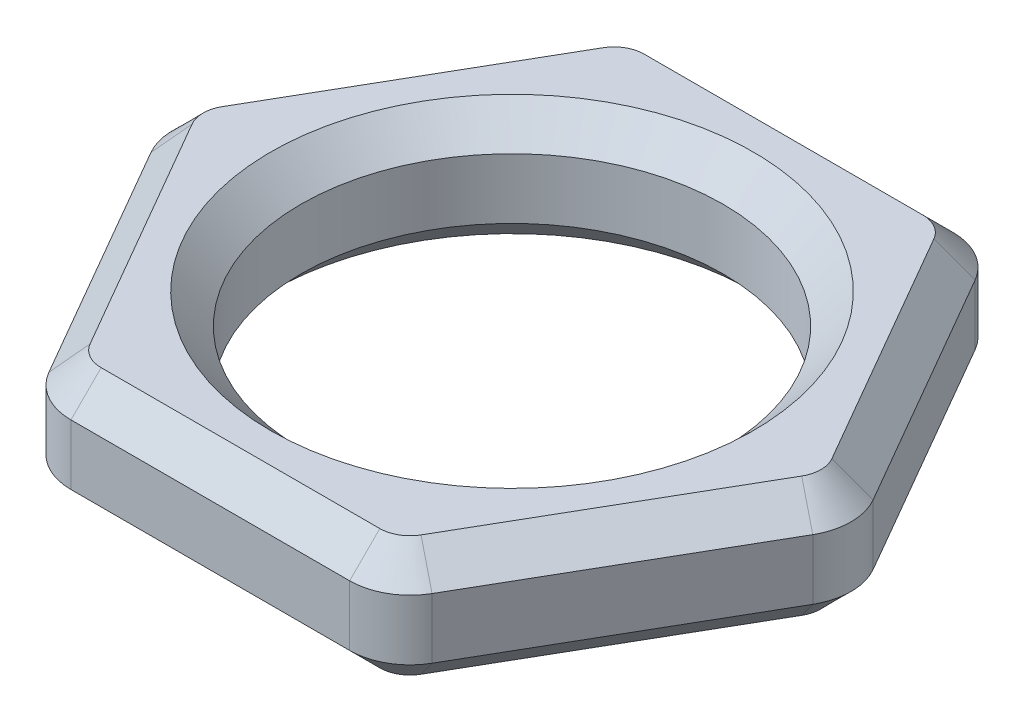
ISO-10303-21;
HEADER;
FILE_DESCRIPTION(('STEP AP214'),'2;1');
FILE_NAME('part.step','',(''),(''),'','','');
FILE_SCHEMA(('AUTOMOTIVE_DESIGN { 1 0 10303 214 1 1 1 1 }'));
ENDSEC;
DATA;
#1=APPLICATION_CONTEXT('core data for automotive mechanical design processes');
#2=APPLICATION_PROTOCOL_DEFINITION('international standard','automotive_design',2000,#1);
#3=PRODUCT_CONTEXT('',#1,'mechanical');
#4=PRODUCT('Part','Part','',(#3));
#5=PRODUCT_RELATED_PRODUCT_CATEGORY('part','',(#4));
#6=PRODUCT_DEFINITION_FORMATION('','',#4);
#7=PRODUCT_DEFINITION_CONTEXT('part definition',#1,'design');
#8=PRODUCT_DEFINITION('design','',#6,#7);
#9=PRODUCT_DEFINITION_SHAPE('','',#8);
#10=(LENGTH_UNIT() NAMED_UNIT(*) SI_UNIT(.MILLI.,.METRE.));
#11=(NAMED_UNIT(*) PLANE_ANGLE_UNIT() SI_UNIT($,.RADIAN.));
#12=(NAMED_UNIT(*) SI_UNIT($,.STERADIAN.) SOLID_ANGLE_UNIT());
#13=UNCERTAINTY_MEASURE_WITH_UNIT(LENGTH_MEASURE(1.E-05),#10,'distance_accuracy_value','');
#14=(GEOMETRIC_REPRESENTATION_CONTEXT(3) GLOBAL_UNCERTAINTY_ASSIGNED_CONTEXT((#13)) GLOBAL_UNIT_ASSIGNED_CONTEXT((#10,
#11,#12)) REPRESENTATION_CONTEXT('',''));
#15=CARTESIAN_POINT('',(0.,0.,0.));
#16=DIRECTION('',(0.,0.,1.));
#17=DIRECTION('',(1.,0.,0.));
#18=AXIS2_PLACEMENT_3D('',#15,#16,#17);
#19=CARTESIAN_POINT('',(0.,2.,0.));
#20=DIRECTION('',(0.,1.,0.));
#21=DIRECTION('',(0.,0.,1.));
#22=AXIS2_PLACEMENT_3D('',#19,#20,#21);
#23=PLANE('',#22);
#24=CARTESIAN_POINT('',(0.,2.,0.));
#25=DIRECTION('',(0.,1.,0.));
#26=DIRECTION('',(0.,0.,1.));
#27=AXIS2_PLACEMENT_3D('',#24,#25,#26);
#28=CIRCLE('',#27,4.);
#29=CARTESIAN_POINT('',(0.,2.,4.));
#30=VERTEX_POINT('',#29);
#31=EDGE_CURVE('E226',#30,#30,#28,.F.);
#32=ORIENTED_EDGE('',*,*,#31,.T.);
#33=EDGE_LOOP('',(#32));
#34=FACE_BOUND('',#33,.T.);
#35=DIRECTION('',(-1.,0.,0.));
#36=VECTOR('',#35,1.);
#37=CARTESIAN_POINT('',(-2.30940107675853,2.,-4.5));
#38=LINE('',#37,#36);
#39=CARTESIAN_POINT('',(2.30940107675849,2.,-4.50000000000001));
#40=VERTEX_POINT('',#39);
#41=CARTESIAN_POINT('',(-2.30940107675853,2.,-4.5));
#42=VERTEX_POINT('',#41);
#43=EDGE_CURVE('E224',#40,#42,#38,.T.);
#44=ORIENTED_EDGE('',*,*,#43,.T.);
#45=CARTESIAN_POINT('',(-2.30940107675852,2.,-3.99999999999999));
#46=DIRECTION('',(0.,1.,0.));
#47=DIRECTION('',(0.,0.,1.));
#48=AXIS2_PLACEMENT_3D('',#45,#46,#47);
#49=CIRCLE('',#48,0.500000000000003);
#50=CARTESIAN_POINT('',(-2.74241377865075,2.,-4.24999999999999));
#51=VERTEX_POINT('',#50);
#52=EDGE_CURVE('E206',#42,#51,#49,.T.);
#53=ORIENTED_EDGE('',*,*,#52,.T.);
#54=DIRECTION('',(-0.499999999999995,0.,0.866025403784442));
#55=VECTOR('',#54,1.);
#56=CARTESIAN_POINT('',(-5.05181485540923,2.,-0.249999999999968));
#57=LINE('',#56,#55);
#58=CARTESIAN_POINT('',(-5.05181485540923,2.,-0.249999999999967));
#59=VERTEX_POINT('',#58);
#60=EDGE_CURVE('E214',#51,#59,#57,.T.);
#61=ORIENTED_EDGE('',*,*,#60,.T.);
#62=CARTESIAN_POINT('',(-4.61880215351701,2.,0.));
#63=DIRECTION('',(0.,1.,0.));
#64=DIRECTION('',(0.,0.,1.));
#65=AXIS2_PLACEMENT_3D('',#62,#63,#64);
#66=CIRCLE('',#65,0.500000000000003);
#67=CARTESIAN_POINT('',(-5.05181485540923,2.,0.250000000000036));
#68=VERTEX_POINT('',#67);
#69=EDGE_CURVE('E220',#59,#68,#66,.T.);
#70=ORIENTED_EDGE('',*,*,#69,.T.);
#71=DIRECTION('',(0.500000000000007,0.,0.866025403784435));
#72=VECTOR('',#71,1.);
#73=CARTESIAN_POINT('',(-2.74241377865069,2.,4.25000000000003));
#74=LINE('',#73,#72);
#75=CARTESIAN_POINT('',(-2.74241377865069,2.,4.25000000000003));
#76=VERTEX_POINT('',#75);
#77=EDGE_CURVE('E421',#68,#76,#74,.T.);
#78=ORIENTED_EDGE('',*,*,#77,.T.);
#79=CARTESIAN_POINT('',(-2.30940107675847,2.,4.00000000000002));
#80=DIRECTION('',(0.,1.,0.));
#81=DIRECTION('',(0.,0.,1.));
#82=AXIS2_PLACEMENT_3D('',#79,#80,#81);
#83=CIRCLE('',#82,0.500000000000003);
#84=CARTESIAN_POINT('',(-2.30940107675846,2.,4.50000000000003));
#85=VERTEX_POINT('',#84);
#86=EDGE_CURVE('E423',#76,#85,#83,.T.);
#87=ORIENTED_EDGE('',*,*,#86,.T.);
#88=DIRECTION('',(1.,0.,0.));
#89=VECTOR('',#88,1.);
#90=CARTESIAN_POINT('',(2.30940107675856,2.,4.49999999999998));
#91=LINE('',#90,#89);
#92=CARTESIAN_POINT('',(2.30940107675856,2.,4.49999999999998));
#93=VERTEX_POINT('',#92);
#94=EDGE_CURVE('E425',#85,#93,#91,.T.);
#95=ORIENTED_EDGE('',*,*,#94,.T.);
#96=CARTESIAN_POINT('',(2.30940107675856,2.,3.99999999999998));
#97=DIRECTION('',(0.,1.,0.));
#98=DIRECTION('',(0.,0.,1.));
#99=AXIS2_PLACEMENT_3D('',#96,#97,#98);
#100=CIRCLE('',#99,0.500000000000003);
#101=CARTESIAN_POINT('',(2.74241377865078,2.,4.24999999999997));
#102=VERTEX_POINT('',#101);
#103=EDGE_CURVE('E427',#93,#102,#100,.T.);
#104=ORIENTED_EDGE('',*,*,#103,.T.);
#105=DIRECTION('',(0.499999999999995,0.,-0.866025403784442));
#106=VECTOR('',#105,1.);
#107=CARTESIAN_POINT('',(5.05181485540923,2.,0.250000000000005));
#108=LINE('',#107,#106);
#109=CARTESIAN_POINT('',(5.05181485540924,2.,0.250000000000004));
#110=VERTEX_POINT('',#109);
#111=EDGE_CURVE('E429',#102,#110,#108,.T.);
#112=ORIENTED_EDGE('',*,*,#111,.T.);
#113=CARTESIAN_POINT('',(4.61880215351701,2.,0.));
#114=DIRECTION('',(0.,1.,0.));
#115=DIRECTION('',(0.,0.,1.));
#116=AXIS2_PLACEMENT_3D('',#113,#114,#115);
#117=CIRCLE('',#116,0.500000000000003);
#118=CARTESIAN_POINT('',(5.05181485540923,2.,-0.249999999999998));
#119=VERTEX_POINT('',#118);
#120=EDGE_CURVE('E431',#110,#119,#117,.T.);
#121=ORIENTED_EDGE('',*,*,#120,.T.);
#122=DIRECTION('',(-0.500000000000001,0.,-0.866025403784438));
#123=VECTOR('',#122,1.);
#124=CARTESIAN_POINT('',(2.74241377865072,2.,-4.25000000000001));
#125=LINE('',#124,#123);
#126=CARTESIAN_POINT('',(2.74241377865072,2.,-4.25000000000001));
#127=VERTEX_POINT('',#126);
#128=EDGE_CURVE('E433',#119,#127,#125,.T.);
#129=ORIENTED_EDGE('',*,*,#128,.T.);
#130=CARTESIAN_POINT('',(2.3094010767585,2.,-4.00000000000001));
#131=DIRECTION('',(0.,1.,0.));
#132=DIRECTION('',(0.,0.,1.));
#133=AXIS2_PLACEMENT_3D('',#130,#131,#132);
#134=CIRCLE('',#133,0.500000000000003);
#135=EDGE_CURVE('E231',#127,#40,#134,.T.);
#136=ORIENTED_EDGE('',*,*,#135,.T.);
#137=EDGE_LOOP('',(#44,#53,#61,#70,#78,#87,#95,#104,#112,#121,#129,#136));
#138=FACE_BOUND('',#137,.T.);
#139=ADVANCED_FACE('F37',(#34,#138),#23,.T.);
#140=CARTESIAN_POINT('',(0.,0.,0.));
#141=DIRECTION('',(0.,1.,0.));
#142=DIRECTION('',(0.,0.,1.));
#143=AXIS2_PLACEMENT_3D('',#140,#141,#142);
#144=PLANE('',#143);
#145=CARTESIAN_POINT('',(0.,0.,0.));
#146=DIRECTION('',(0.,1.,0.));
#147=DIRECTION('',(0.,0.,1.));
#148=AXIS2_PLACEMENT_3D('',#145,#146,#147);
#149=CIRCLE('',#148,4.);
#150=CARTESIAN_POINT('',(0.,0.,4.));
#151=VERTEX_POINT('',#150);
#152=EDGE_CURVE('E11',#151,#151,#149,.T.);
#153=ORIENTED_EDGE('',*,*,#152,.T.);
#154=EDGE_LOOP('',(#153));
#155=FACE_BOUND('',#154,.T.);
#156=DIRECTION('',(-1.,0.,0.));
#157=VECTOR('',#156,1.);
#158=CARTESIAN_POINT('',(0.,0.,4.49999999999999));
#159=LINE('',#158,#157);
#160=CARTESIAN_POINT('',(2.30940107675856,0.,4.49999999999997));
#161=VERTEX_POINT('',#160);
#162=CARTESIAN_POINT('',(-2.30940107675846,0.,4.50000000000002));
#163=VERTEX_POINT('',#162);
#164=EDGE_CURVE('E55',#161,#163,#159,.T.);
#165=ORIENTED_EDGE('',*,*,#164,.T.);
#166=CARTESIAN_POINT('',(-2.30940107675847,0.,4.00000000000002));
#167=DIRECTION('',(0.,1.,0.));
#168=DIRECTION('',(0.,0.,1.));
#169=AXIS2_PLACEMENT_3D('',#166,#167,#168);
#170=CIRCLE('',#169,0.499999999999995);
#171=CARTESIAN_POINT('',(-2.74241377865068,0.,4.25000000000002));
#172=VERTEX_POINT('',#171);
#173=EDGE_CURVE('E47',#163,#172,#170,.F.);
#174=ORIENTED_EDGE('',*,*,#173,.T.);
#175=DIRECTION('',(-0.500000000000007,0.,-0.866025403784435));
#176=VECTOR('',#175,1.);
#177=CARTESIAN_POINT('',(-3.89711431702995,0.,2.25000000000003));
#178=LINE('',#177,#176);
#179=CARTESIAN_POINT('',(-5.05181485540922,0.,0.250000000000033));
#180=VERTEX_POINT('',#179);
#181=EDGE_CURVE('E282',#172,#180,#178,.T.);
#182=ORIENTED_EDGE('',*,*,#181,.T.);
#183=CARTESIAN_POINT('',(-4.61880215351701,0.,0.));
#184=DIRECTION('',(0.,1.,0.));
#185=DIRECTION('',(0.,0.,1.));
#186=AXIS2_PLACEMENT_3D('',#183,#184,#185);
#187=CIRCLE('',#186,0.499999999999996);
#188=CARTESIAN_POINT('',(-5.05181485540923,0.,-0.249999999999964));
#189=VERTEX_POINT('',#188);
#190=EDGE_CURVE('E284',#180,#189,#187,.F.);
#191=ORIENTED_EDGE('',*,*,#190,.T.);
#192=DIRECTION('',(0.499999999999995,0.,-0.866025403784442));
#193=VECTOR('',#192,1.);
#194=CARTESIAN_POINT('',(-3.89711431702998,0.,-2.24999999999997));
#195=LINE('',#194,#193);
#196=CARTESIAN_POINT('',(-2.74241377865074,0.,-4.24999999999999));
#197=VERTEX_POINT('',#196);
#198=EDGE_CURVE('E286',#189,#197,#195,.T.);
#199=ORIENTED_EDGE('',*,*,#198,.T.);
#200=CARTESIAN_POINT('',(-2.30940107675852,0.,-3.99999999999999));
#201=DIRECTION('',(0.,1.,0.));
#202=DIRECTION('',(0.,0.,1.));
#203=AXIS2_PLACEMENT_3D('',#200,#201,#202);
#204=CIRCLE('',#203,0.499999999999995);
#205=CARTESIAN_POINT('',(-2.30940107675853,0.,-4.49999999999999));
#206=VERTEX_POINT('',#205);
#207=EDGE_CURVE('E288',#197,#206,#204,.F.);
#208=ORIENTED_EDGE('',*,*,#207,.T.);
#209=DIRECTION('',(1.,0.,0.));
#210=VECTOR('',#209,1.);
#211=CARTESIAN_POINT('',(0.,0.,-4.5));
#212=LINE('',#211,#210);
#213=CARTESIAN_POINT('',(2.30940107675849,0.,-4.5));
#214=VERTEX_POINT('',#213);
#215=EDGE_CURVE('E290',#206,#214,#212,.T.);
#216=ORIENTED_EDGE('',*,*,#215,.T.);
#217=CARTESIAN_POINT('',(2.3094010767585,0.,-4.00000000000001));
#218=DIRECTION('',(0.,1.,0.));
#219=DIRECTION('',(0.,0.,1.));
#220=AXIS2_PLACEMENT_3D('',#217,#218,#219);
#221=CIRCLE('',#220,0.499999999999995);
#222=CARTESIAN_POINT('',(2.74241377865071,0.,-4.25000000000001));
#223=VERTEX_POINT('',#222);
#224=EDGE_CURVE('E292',#214,#223,#221,.F.);
#225=ORIENTED_EDGE('',*,*,#224,.T.);
#226=DIRECTION('',(0.500000000000001,0.,0.866025403784438));
#227=VECTOR('',#226,1.);
#228=CARTESIAN_POINT('',(3.89711431702997,0.,-2.25));
#229=LINE('',#228,#227);
#230=CARTESIAN_POINT('',(5.05181485540923,0.,-0.249999999999995));
#231=VERTEX_POINT('',#230);
#232=EDGE_CURVE('E294',#223,#231,#229,.T.);
#233=ORIENTED_EDGE('',*,*,#232,.T.);
#234=CARTESIAN_POINT('',(4.61880215351701,0.,0.));
#235=DIRECTION('',(0.,1.,0.));
#236=DIRECTION('',(0.,0.,1.));
#237=AXIS2_PLACEMENT_3D('',#234,#235,#236);
#238=CIRCLE('',#237,0.499999999999995);
#239=CARTESIAN_POINT('',(5.05181485540923,0.,0.249999999999999));
#240=VERTEX_POINT('',#239);
#241=EDGE_CURVE('E296',#231,#240,#238,.F.);
#242=ORIENTED_EDGE('',*,*,#241,.T.);
#243=DIRECTION('',(-0.499999999999995,0.,0.866025403784442));
#244=VECTOR('',#243,1.);
#245=CARTESIAN_POINT('',(3.89711431703,0.,2.24999999999998));
#246=LINE('',#245,#244);
#247=CARTESIAN_POINT('',(2.74241377865077,0.,4.24999999999997));
#248=VERTEX_POINT('',#247);
#249=EDGE_CURVE('E298',#240,#248,#246,.T.);
#250=ORIENTED_EDGE('',*,*,#249,.T.);
#251=CARTESIAN_POINT('',(2.30940107675856,0.,3.99999999999998));
#252=DIRECTION('',(0.,1.,0.));
#253=DIRECTION('',(0.,0.,1.));
#254=AXIS2_PLACEMENT_3D('',#251,#252,#253);
#255=CIRCLE('',#254,0.499999999999995);
#256=EDGE_CURVE('E60',#248,#161,#255,.F.);
#257=ORIENTED_EDGE('',*,*,#256,.T.);
#258=EDGE_LOOP('',(#165,#174,#182,#191,#199,#208,#216,#225,#233,#242,#250,#257));
#259=FACE_BOUND('',#258,.T.);
#260=ADVANCED_FACE('F542',(#155,#259),#144,.F.);
#261=CARTESIAN_POINT('',(2.88675134594819,2.,4.99999999999997));
#262=DIRECTION('',(-0.866025403784441,0.,-0.499999999999995));
#263=DIRECTION('',(-0.499999999999995,0.,0.866025403784442));
#264=AXIS2_PLACEMENT_3D('',#261,#262,#263);
#265=PLANE('',#264);
#266=DIRECTION('',(0.,-1.,0.));
#267=VECTOR('',#266,1.);
#268=CARTESIAN_POINT('',(5.48482755730145,2.,0.5));
#269=LINE('',#268,#267);
#270=CARTESIAN_POINT('',(5.48482755730145,0.500000000000002,0.5));
#271=VERTEX_POINT('',#270);
#272=CARTESIAN_POINT('',(5.48482755730145,1.5,0.5));
#273=VERTEX_POINT('',#272);
#274=EDGE_CURVE('E406',#271,#273,#269,.F.);
#275=ORIENTED_EDGE('',*,*,#274,.T.);
#276=DIRECTION('',(-0.499999999999995,0.,0.866025403784442));
#277=VECTOR('',#276,1.);
#278=CARTESIAN_POINT('',(3.175426480543,1.5,4.49999999999997));
#279=LINE('',#278,#277);
#280=CARTESIAN_POINT('',(3.175426480543,1.5,4.49999999999997));
#281=VERTEX_POINT('',#280);
#282=EDGE_CURVE('E255',#273,#281,#279,.T.);
#283=ORIENTED_EDGE('',*,*,#282,.T.);
#284=DIRECTION('',(0.,-1.,0.));
#285=VECTOR('',#284,1.);
#286=CARTESIAN_POINT('',(3.175426480543,2.,4.49999999999997));
#287=LINE('',#286,#285);
#288=CARTESIAN_POINT('',(3.175426480543,0.500000000000002,4.49999999999997));
#289=VERTEX_POINT('',#288);
#290=EDGE_CURVE('E403',#281,#289,#287,.T.);
#291=ORIENTED_EDGE('',*,*,#290,.T.);
#292=DIRECTION('',(0.499999999999995,0.,-0.866025403784442));
#293=VECTOR('',#292,1.);
#294=CARTESIAN_POINT('',(2.88675134594819,0.500000000000002,4.99999999999997));
#295=LINE('',#294,#293);
#296=EDGE_CURVE('E253',#289,#271,#295,.T.);
#297=ORIENTED_EDGE('',*,*,#296,.T.);
#298=EDGE_LOOP('',(#275,#283,#291,#297));
#299=FACE_BOUND('',#298,.T.);
#300=ADVANCED_FACE('F562',(#299),#265,.F.);
#301=CARTESIAN_POINT('',(5.77350269189626,2.,0.));
#302=DIRECTION('',(-0.866025403784438,0.,0.500000000000001));
#303=DIRECTION('',(0.500000000000001,0.,0.866025403784438));
#304=AXIS2_PLACEMENT_3D('',#301,#302,#303);
#305=PLANE('',#304);
#306=DIRECTION('',(0.,-1.,0.));
#307=VECTOR('',#306,1.);
#308=CARTESIAN_POINT('',(3.17542648054293,2.,-4.50000000000001));
#309=LINE('',#308,#307);
#310=CARTESIAN_POINT('',(3.17542648054293,0.500000000000002,-4.50000000000001));
#311=VERTEX_POINT('',#310);
#312=CARTESIAN_POINT('',(3.17542648054293,1.5,-4.50000000000001));
#313=VERTEX_POINT('',#312);
#314=EDGE_CURVE('E384',#311,#313,#309,.F.);
#315=ORIENTED_EDGE('',*,*,#314,.T.);
#316=DIRECTION('',(0.500000000000001,0.,0.866025403784438));
#317=VECTOR('',#316,1.);
#318=CARTESIAN_POINT('',(5.48482755730145,1.5,-0.499999999999998));
#319=LINE('',#318,#317);
#320=CARTESIAN_POINT('',(5.48482755730145,1.5,-0.499999999999997));
#321=VERTEX_POINT('',#320);
#322=EDGE_CURVE('E247',#313,#321,#319,.T.);
#323=ORIENTED_EDGE('',*,*,#322,.T.);
#324=DIRECTION('',(0.,-1.,0.));
#325=VECTOR('',#324,1.);
#326=CARTESIAN_POINT('',(5.48482755730145,2.,-0.499999999999997));
#327=LINE('',#326,#325);
#328=CARTESIAN_POINT('',(5.48482755730145,0.500000000000002,-0.499999999999997));
#329=VERTEX_POINT('',#328);
#330=EDGE_CURVE('E393',#321,#329,#327,.T.);
#331=ORIENTED_EDGE('',*,*,#330,.T.);
#332=DIRECTION('',(-0.500000000000001,0.,-0.866025403784438));
#333=VECTOR('',#332,1.);
#334=CARTESIAN_POINT('',(5.77350269189626,0.500000000000002,0.));
#335=LINE('',#334,#333);
#336=EDGE_CURVE('E245',#329,#311,#335,.T.);
#337=ORIENTED_EDGE('',*,*,#336,.T.);
#338=EDGE_LOOP('',(#315,#323,#331,#337));
#339=FACE_BOUND('',#338,.T.);
#340=ADVANCED_FACE('F528',(#339),#305,.F.);
#341=CARTESIAN_POINT('',(2.88675134594812,2.,-5.00000000000001));
#342=DIRECTION('',(0.,0.,1.));
#343=DIRECTION('',(1.,0.,0.));
#344=AXIS2_PLACEMENT_3D('',#341,#342,#343);
#345=PLANE('',#344);
#346=DIRECTION('',(0.,-1.,0.));
#347=VECTOR('',#346,1.);
#348=CARTESIAN_POINT('',(-2.30940107675853,2.,-4.99999999999999));
#349=LINE('',#348,#347);
#350=CARTESIAN_POINT('',(-2.30940107675853,0.500000000000002,-4.99999999999999));
#351=VERTEX_POINT('',#350);
#352=CARTESIAN_POINT('',(-2.30940107675853,1.5,-4.99999999999999));
#353=VERTEX_POINT('',#352);
#354=EDGE_CURVE('E390',#351,#353,#349,.F.);
#355=ORIENTED_EDGE('',*,*,#354,.T.);
#356=DIRECTION('',(1.,0.,0.));
#357=VECTOR('',#356,1.);
#358=CARTESIAN_POINT('',(2.30940107675849,1.5,-5.00000000000001));
#359=LINE('',#358,#357);
#360=CARTESIAN_POINT('',(2.30940107675849,1.5,-5.00000000000001));
#361=VERTEX_POINT('',#360);
#362=EDGE_CURVE('E239',#353,#361,#359,.T.);
#363=ORIENTED_EDGE('',*,*,#362,.T.);
#364=DIRECTION('',(0.,-1.,0.));
#365=VECTOR('',#364,1.);
#366=CARTESIAN_POINT('',(2.30940107675849,2.,-5.00000000000001));
#367=LINE('',#366,#365);
#368=CARTESIAN_POINT('',(2.30940107675849,0.500000000000002,-5.00000000000001));
#369=VERTEX_POINT('',#368);
#370=EDGE_CURVE('E381',#361,#369,#367,.T.);
#371=ORIENTED_EDGE('',*,*,#370,.T.);
#372=DIRECTION('',(-1.,0.,0.));
#373=VECTOR('',#372,1.);
#374=CARTESIAN_POINT('',(2.88675134594812,0.500000000000002,-5.00000000000001));
#375=LINE('',#374,#373);
#376=EDGE_CURVE('E237',#369,#351,#375,.T.);
#377=ORIENTED_EDGE('',*,*,#376,.T.);
#378=EDGE_LOOP('',(#355,#363,#371,#377));
#379=FACE_BOUND('',#378,.T.);
#380=ADVANCED_FACE('F387',(#379),#345,.F.);
#381=CARTESIAN_POINT('',(-2.88675134594815,2.,-4.99999999999999));
#382=DIRECTION('',(0.866025403784442,0.,0.499999999999995));
#383=DIRECTION('',(0.499999999999995,0.,-0.866025403784442));
#384=AXIS2_PLACEMENT_3D('',#381,#382,#383);
#385=PLANE('',#384);
#386=DIRECTION('',(0.,-1.,0.));
#387=VECTOR('',#386,1.);
#388=CARTESIAN_POINT('',(-5.48482755730145,2.,-0.499999999999963));
#389=LINE('',#388,#387);
#390=CARTESIAN_POINT('',(-5.48482755730145,0.500000000000002,-0.499999999999963));
#391=VERTEX_POINT('',#390);
#392=CARTESIAN_POINT('',(-5.48482755730145,1.5,-0.499999999999963));
#393=VERTEX_POINT('',#392);
#394=EDGE_CURVE('E391',#391,#393,#389,.F.);
#395=ORIENTED_EDGE('',*,*,#394,.T.);
#396=DIRECTION('',(0.499999999999995,0.,-0.866025403784442));
#397=VECTOR('',#396,1.);
#398=CARTESIAN_POINT('',(-3.17542648054297,1.5,-4.49999999999999));
#399=LINE('',#398,#397);
#400=CARTESIAN_POINT('',(-3.17542648054296,1.5,-4.49999999999999));
#401=VERTEX_POINT('',#400);
#402=EDGE_CURVE('E280',#393,#401,#399,.T.);
#403=ORIENTED_EDGE('',*,*,#402,.T.);
#404=DIRECTION('',(0.,-1.,0.));
#405=VECTOR('',#404,1.);
#406=CARTESIAN_POINT('',(-3.17542648054296,2.,-4.49999999999999));
#407=LINE('',#406,#405);
#408=CARTESIAN_POINT('',(-3.17542648054296,0.500000000000002,-4.49999999999999));
#409=VERTEX_POINT('',#408);
#410=EDGE_CURVE('E396',#401,#409,#407,.T.);
#411=ORIENTED_EDGE('',*,*,#410,.T.);
#412=DIRECTION('',(-0.499999999999995,0.,0.866025403784442));
#413=VECTOR('',#412,1.);
#414=CARTESIAN_POINT('',(-2.88675134594815,0.500000000000002,-4.99999999999999));
#415=LINE('',#414,#413);
#416=EDGE_CURVE('E278',#409,#391,#415,.T.);
#417=ORIENTED_EDGE('',*,*,#416,.T.);
#418=EDGE_LOOP('',(#395,#403,#411,#417));
#419=FACE_BOUND('',#418,.T.);
#420=ADVANCED_FACE('F479',(#419),#385,.F.);
#421=CARTESIAN_POINT('',(-5.77350269189626,2.,0.));
#422=DIRECTION('',(0.866025403784435,0.,-0.500000000000007));
#423=DIRECTION('',(-0.500000000000007,0.,-0.866025403784435));
#424=AXIS2_PLACEMENT_3D('',#421,#422,#423);
#425=PLANE('',#424);
#426=DIRECTION('',(0.,-1.,0.));
#427=VECTOR('',#426,1.);
#428=CARTESIAN_POINT('',(-3.1754264805429,2.,4.50000000000003));
#429=LINE('',#428,#427);
#430=CARTESIAN_POINT('',(-3.1754264805429,0.500000000000002,4.50000000000003));
#431=VERTEX_POINT('',#430);
#432=CARTESIAN_POINT('',(-3.1754264805429,1.5,4.50000000000003));
#433=VERTEX_POINT('',#432);
#434=EDGE_CURVE('E332',#431,#433,#429,.F.);
#435=ORIENTED_EDGE('',*,*,#434,.T.);
#436=DIRECTION('',(-0.500000000000007,0.,-0.866025403784435));
#437=VECTOR('',#436,1.);
#438=CARTESIAN_POINT('',(-5.48482755730144,1.5,0.500000000000038));
#439=LINE('',#438,#437);
#440=CARTESIAN_POINT('',(-5.48482755730144,1.5,0.500000000000038));
#441=VERTEX_POINT('',#440);
#442=EDGE_CURVE('E272',#433,#441,#439,.T.);
#443=ORIENTED_EDGE('',*,*,#442,.T.);
#444=DIRECTION('',(0.,-1.,0.));
#445=VECTOR('',#444,1.);
#446=CARTESIAN_POINT('',(-5.48482755730144,2.,0.500000000000038));
#447=LINE('',#446,#445);
#448=CARTESIAN_POINT('',(-5.48482755730144,0.500000000000002,0.500000000000038));
#449=VERTEX_POINT('',#448);
#450=EDGE_CURVE('E450',#441,#449,#447,.T.);
#451=ORIENTED_EDGE('',*,*,#450,.T.);
#452=DIRECTION('',(0.500000000000007,0.,0.866025403784435));
#453=VECTOR('',#452,1.);
#454=CARTESIAN_POINT('',(-5.77350269189626,0.500000000000002,0.));
#455=LINE('',#454,#453);
#456=EDGE_CURVE('E270',#449,#431,#455,.T.);
#457=ORIENTED_EDGE('',*,*,#456,.T.);
#458=EDGE_LOOP('',(#435,#443,#451,#457));
#459=FACE_BOUND('',#458,.T.);
#460=ADVANCED_FACE('F458',(#459),#425,.F.);
#461=CARTESIAN_POINT('',(-2.88675134594808,2.,5.00000000000003));
#462=DIRECTION('',(0.,0.,-1.));
#463=DIRECTION('',(-1.,0.,0.));
#464=AXIS2_PLACEMENT_3D('',#461,#462,#463);
#465=PLANE('',#464);
#466=DIRECTION('',(0.,-1.,0.));
#467=VECTOR('',#466,1.);
#468=CARTESIAN_POINT('',(2.30940107675857,2.,4.99999999999998));
#469=LINE('',#468,#467);
#470=CARTESIAN_POINT('',(2.30940107675857,0.500000000000002,4.99999999999998));
#471=VERTEX_POINT('',#470);
#472=CARTESIAN_POINT('',(2.30940107675857,1.5,4.99999999999998));
#473=VERTEX_POINT('',#472);
#474=EDGE_CURVE('E412',#471,#473,#469,.F.);
#475=ORIENTED_EDGE('',*,*,#474,.T.);
#476=DIRECTION('',(-1.,0.,0.));
#477=VECTOR('',#476,1.);
#478=CARTESIAN_POINT('',(-2.30940107675846,1.5,5.00000000000002));
#479=LINE('',#478,#477);
#480=CARTESIAN_POINT('',(-2.30940107675846,1.5,5.00000000000002));
#481=VERTEX_POINT('',#480);
#482=EDGE_CURVE('E263',#473,#481,#479,.T.);
#483=ORIENTED_EDGE('',*,*,#482,.T.);
#484=DIRECTION('',(0.,-1.,0.));
#485=VECTOR('',#484,1.);
#486=CARTESIAN_POINT('',(-2.30940107675846,2.,5.00000000000002));
#487=LINE('',#486,#485);
#488=CARTESIAN_POINT('',(-2.30940107675846,0.500000000000002,5.00000000000002));
#489=VERTEX_POINT('',#488);
#490=EDGE_CURVE('E409',#481,#489,#487,.T.);
#491=ORIENTED_EDGE('',*,*,#490,.T.);
#492=DIRECTION('',(1.,0.,0.));
#493=VECTOR('',#492,1.);
#494=CARTESIAN_POINT('',(-2.88675134594808,0.500000000000002,5.00000000000003));
#495=LINE('',#494,#493);
#496=EDGE_CURVE('E261',#489,#471,#495,.T.);
#497=ORIENTED_EDGE('',*,*,#496,.T.);
#498=EDGE_LOOP('',(#475,#483,#491,#497));
#499=FACE_BOUND('',#498,.T.);
#500=ADVANCED_FACE('F501',(#499),#465,.F.);
#501=CARTESIAN_POINT('',(0.,2.,0.));
#502=DIRECTION('',(0.,-1.,0.));
#503=DIRECTION('',(0.,0.,-1.));
#504=AXIS2_PLACEMENT_3D('',#501,#502,#503);
#505=CYLINDRICAL_SURFACE('',#504,3.5);
#506=CARTESIAN_POINT('',(0.,1.5,0.));
#507=DIRECTION('',(0.,1.,0.));
#508=DIRECTION('',(0.,0.,1.));
#509=AXIS2_PLACEMENT_3D('',#506,#507,#508);
#510=CIRCLE('',#509,3.5);
#511=CARTESIAN_POINT('',(0.,1.5,3.5));
#512=VERTEX_POINT('',#511);
#513=EDGE_CURVE('E221',#512,#512,#510,.T.);
#514=ORIENTED_EDGE('',*,*,#513,.T.);
#515=EDGE_LOOP('',(#514));
#516=FACE_BOUND('',#515,.T.);
#517=CARTESIAN_POINT('',(0.,0.500000000000001,0.));
#518=DIRECTION('',(0.,1.,0.));
#519=DIRECTION('',(0.,0.,1.));
#520=AXIS2_PLACEMENT_3D('',#517,#518,#519);
#521=CIRCLE('',#520,3.5);
#522=CARTESIAN_POINT('',(0.,0.500000000000001,3.5));
#523=VERTEX_POINT('',#522);
#524=EDGE_CURVE('E415',#523,#523,#521,.F.);
#525=ORIENTED_EDGE('',*,*,#524,.T.);
#526=EDGE_LOOP('',(#525));
#527=FACE_BOUND('',#526,.T.);
#528=ADVANCED_FACE('F566',(#516,#527),#505,.F.);
#529=CARTESIAN_POINT('',(-4.61880215351701,2.,0.));
#530=DIRECTION('',(0.,-1.,0.));
#531=DIRECTION('',(0.,0.,-1.));
#532=AXIS2_PLACEMENT_3D('',#529,#530,#531);
#533=CYLINDRICAL_SURFACE('',#532,1.);
#534=ORIENTED_EDGE('',*,*,#450,.F.);
#535=CARTESIAN_POINT('',(-4.61880215351701,1.5,0.));
#536=DIRECTION('',(0.,1.,0.));
#537=DIRECTION('',(0.,0.,1.));
#538=AXIS2_PLACEMENT_3D('',#535,#536,#537);
#539=CIRCLE('',#538,1.);
#540=EDGE_CURVE('E276',#441,#393,#539,.F.);
#541=ORIENTED_EDGE('',*,*,#540,.T.);
#542=ORIENTED_EDGE('',*,*,#394,.F.);
#543=CARTESIAN_POINT('',(-4.61880215351701,0.500000000000002,0.));
#544=DIRECTION('',(0.,1.,0.));
#545=DIRECTION('',(0.,0.,1.));
#546=AXIS2_PLACEMENT_3D('',#543,#544,#545);
#547=CIRCLE('',#546,1.);
#548=EDGE_CURVE('E274',#391,#449,#547,.T.);
#549=ORIENTED_EDGE('',*,*,#548,.T.);
#550=EDGE_LOOP('',(#534,#541,#542,#549));
#551=FACE_BOUND('',#550,.T.);
#552=ADVANCED_FACE('F477',(#551),#533,.T.);
#553=CARTESIAN_POINT('',(-2.30940107675852,2.,-3.99999999999999));
#554=DIRECTION('',(0.,-1.,0.));
#555=DIRECTION('',(0.,0.,-1.));
#556=AXIS2_PLACEMENT_3D('',#553,#554,#555);
#557=CYLINDRICAL_SURFACE('',#556,1.);
#558=ORIENTED_EDGE('',*,*,#410,.F.);
#559=CARTESIAN_POINT('',(-2.30940107675852,1.5,-3.99999999999999));
#560=DIRECTION('',(0.,1.,0.));
#561=DIRECTION('',(0.,0.,1.));
#562=AXIS2_PLACEMENT_3D('',#559,#560,#561);
#563=CIRCLE('',#562,1.);
#564=EDGE_CURVE('E208',#401,#353,#563,.F.);
#565=ORIENTED_EDGE('',*,*,#564,.T.);
#566=ORIENTED_EDGE('',*,*,#354,.F.);
#567=CARTESIAN_POINT('',(-2.30940107675852,0.500000000000002,-3.99999999999999));
#568=DIRECTION('',(0.,1.,0.));
#569=DIRECTION('',(0.,0.,1.));
#570=AXIS2_PLACEMENT_3D('',#567,#568,#569);
#571=CIRCLE('',#570,1.);
#572=EDGE_CURVE('E229',#351,#409,#571,.T.);
#573=ORIENTED_EDGE('',*,*,#572,.T.);
#574=EDGE_LOOP('',(#558,#565,#566,#573));
#575=FACE_BOUND('',#574,.T.);
#576=ADVANCED_FACE('F444',(#575),#557,.T.);
#577=CARTESIAN_POINT('',(2.3094010767585,2.,-4.00000000000001));
#578=DIRECTION('',(0.,-1.,0.));
#579=DIRECTION('',(0.,0.,-1.));
#580=AXIS2_PLACEMENT_3D('',#577,#578,#579);
#581=CYLINDRICAL_SURFACE('',#580,1.);
#582=ORIENTED_EDGE('',*,*,#370,.F.);
#583=CARTESIAN_POINT('',(2.3094010767585,1.5,-4.00000000000001));
#584=DIRECTION('',(0.,1.,0.));
#585=DIRECTION('',(0.,0.,1.));
#586=AXIS2_PLACEMENT_3D('',#583,#584,#585);
#587=CIRCLE('',#586,1.);
#588=EDGE_CURVE('E243',#361,#313,#587,.F.);
#589=ORIENTED_EDGE('',*,*,#588,.T.);
#590=ORIENTED_EDGE('',*,*,#314,.F.);
#591=CARTESIAN_POINT('',(2.3094010767585,0.500000000000002,-4.00000000000001));
#592=DIRECTION('',(0.,1.,0.));
#593=DIRECTION('',(0.,0.,1.));
#594=AXIS2_PLACEMENT_3D('',#591,#592,#593);
#595=CIRCLE('',#594,1.);
#596=EDGE_CURVE('E241',#311,#369,#595,.T.);
#597=ORIENTED_EDGE('',*,*,#596,.T.);
#598=EDGE_LOOP('',(#582,#589,#590,#597));
#599=FACE_BOUND('',#598,.T.);
#600=ADVANCED_FACE('F380',(#599),#581,.T.);
#601=CARTESIAN_POINT('',(4.61880215351701,2.,0.));
#602=DIRECTION('',(0.,-1.,0.));
#603=DIRECTION('',(0.,0.,-1.));
#604=AXIS2_PLACEMENT_3D('',#601,#602,#603);
#605=CYLINDRICAL_SURFACE('',#604,1.);
#606=ORIENTED_EDGE('',*,*,#330,.F.);
#607=CARTESIAN_POINT('',(4.61880215351701,1.5,0.));
#608=DIRECTION('',(0.,1.,0.));
#609=DIRECTION('',(0.,0.,1.));
#610=AXIS2_PLACEMENT_3D('',#607,#608,#609);
#611=CIRCLE('',#610,1.);
#612=EDGE_CURVE('E251',#321,#273,#611,.F.);
#613=ORIENTED_EDGE('',*,*,#612,.T.);
#614=ORIENTED_EDGE('',*,*,#274,.F.);
#615=CARTESIAN_POINT('',(4.61880215351701,0.500000000000002,0.));
#616=DIRECTION('',(0.,1.,0.));
#617=DIRECTION('',(0.,0.,1.));
#618=AXIS2_PLACEMENT_3D('',#615,#616,#617);
#619=CIRCLE('',#618,1.);
#620=EDGE_CURVE('E249',#271,#329,#619,.T.);
#621=ORIENTED_EDGE('',*,*,#620,.T.);
#622=EDGE_LOOP('',(#606,#613,#614,#621));
#623=FACE_BOUND('',#622,.T.);
#624=ADVANCED_FACE('F530',(#623),#605,.T.);
#625=CARTESIAN_POINT('',(2.30940107675856,2.,3.99999999999998));
#626=DIRECTION('',(0.,-1.,0.));
#627=DIRECTION('',(0.,0.,-1.));
#628=AXIS2_PLACEMENT_3D('',#625,#626,#627);
#629=CYLINDRICAL_SURFACE('',#628,1.);
#630=ORIENTED_EDGE('',*,*,#290,.F.);
#631=CARTESIAN_POINT('',(2.30940107675856,1.5,3.99999999999998));
#632=DIRECTION('',(0.,1.,0.));
#633=DIRECTION('',(0.,0.,1.));
#634=AXIS2_PLACEMENT_3D('',#631,#632,#633);
#635=CIRCLE('',#634,1.);
#636=EDGE_CURVE('E259',#281,#473,#635,.F.);
#637=ORIENTED_EDGE('',*,*,#636,.T.);
#638=ORIENTED_EDGE('',*,*,#474,.F.);
#639=CARTESIAN_POINT('',(2.30940107675856,0.500000000000002,3.99999999999998));
#640=DIRECTION('',(0.,1.,0.));
#641=DIRECTION('',(0.,0.,1.));
#642=AXIS2_PLACEMENT_3D('',#639,#640,#641);
#643=CIRCLE('',#642,1.);
#644=EDGE_CURVE('E257',#471,#289,#643,.T.);
#645=ORIENTED_EDGE('',*,*,#644,.T.);
#646=EDGE_LOOP('',(#630,#637,#638,#645));
#647=FACE_BOUND('',#646,.T.);
#648=ADVANCED_FACE('F589',(#647),#629,.T.);
#649=CARTESIAN_POINT('',(-2.30940107675847,2.,4.00000000000002));
#650=DIRECTION('',(0.,-1.,0.));
#651=DIRECTION('',(0.,0.,-1.));
#652=AXIS2_PLACEMENT_3D('',#649,#650,#651);
#653=CYLINDRICAL_SURFACE('',#652,1.);
#654=ORIENTED_EDGE('',*,*,#490,.F.);
#655=CARTESIAN_POINT('',(-2.30940107675847,1.5,4.00000000000002));
#656=DIRECTION('',(0.,1.,0.));
#657=DIRECTION('',(0.,0.,1.));
#658=AXIS2_PLACEMENT_3D('',#655,#656,#657);
#659=CIRCLE('',#658,1.);
#660=EDGE_CURVE('E268',#481,#433,#659,.F.);
#661=ORIENTED_EDGE('',*,*,#660,.T.);
#662=ORIENTED_EDGE('',*,*,#434,.F.);
#663=CARTESIAN_POINT('',(-2.30940107675847,0.500000000000002,4.00000000000002));
#664=DIRECTION('',(0.,1.,0.));
#665=DIRECTION('',(0.,0.,1.));
#666=AXIS2_PLACEMENT_3D('',#663,#664,#665);
#667=CIRCLE('',#666,1.);
#668=EDGE_CURVE('E265',#431,#489,#667,.T.);
#669=ORIENTED_EDGE('',*,*,#668,.T.);
#670=EDGE_LOOP('',(#654,#661,#662,#669));
#671=FACE_BOUND('',#670,.T.);
#672=ADVANCED_FACE('F498',(#671),#653,.T.);
#673=CARTESIAN_POINT('',(0.,1.5,0.));
#674=DIRECTION('',(0.,1.,0.));
#675=DIRECTION('',(0.,0.,1.));
#676=AXIS2_PLACEMENT_3D('',#673,#674,#675);
#677=CONICAL_SURFACE('',#676,3.5,0.78539816339745);
#678=ORIENTED_EDGE('',*,*,#31,.F.);
#679=EDGE_LOOP('',(#678));
#680=FACE_BOUND('',#679,.T.);
#681=ORIENTED_EDGE('',*,*,#513,.F.);
#682=EDGE_LOOP('',(#681));
#683=FACE_BOUND('',#682,.T.);
#684=ADVANCED_FACE('F595',(#680,#683),#677,.F.);
#685=CARTESIAN_POINT('',(2.30940107675856,2.,3.99999999999998));
#686=DIRECTION('',(0.,-1.,0.));
#687=DIRECTION('',(0.,0.,-1.));
#688=AXIS2_PLACEMENT_3D('',#685,#686,#687);
#689=CONICAL_SURFACE('',#688,0.500000000000003,0.785398163397445);
#690=DIRECTION('',(0.,0.70710678118655,-0.707106781186545));
#691=VECTOR('',#690,1.);
#692=CARTESIAN_POINT('',(2.30940107675857,1.5,4.99999999999998));
#693=LINE('',#692,#691);
#694=EDGE_CURVE('E326',#473,#93,#693,.T.);
#695=ORIENTED_EDGE('',*,*,#694,.F.);
#696=ORIENTED_EDGE('',*,*,#636,.F.);
#697=DIRECTION('',(0.612372435695794,-0.70710678118655,0.35355339059327));
#698=VECTOR('',#697,1.);
#699=CARTESIAN_POINT('',(2.74241377865078,2.,4.24999999999997));
#700=LINE('',#699,#698);
#701=EDGE_CURVE('E329',#102,#281,#700,.T.);
#702=ORIENTED_EDGE('',*,*,#701,.F.);
#703=ORIENTED_EDGE('',*,*,#103,.F.);
#704=EDGE_LOOP('',(#695,#696,#702,#703));
#705=FACE_BOUND('',#704,.T.);
#706=ADVANCED_FACE('F511',(#705),#689,.T.);
#707=CARTESIAN_POINT('',(3.89711431703001,2.,2.24999999999999));
#708=DIRECTION('',(0.612372435695799,0.707106781186545,0.353553390593272));
#709=DIRECTION('',(-0.499999999999995,0.,0.866025403784442));
#710=AXIS2_PLACEMENT_3D('',#707,#708,#709);
#711=PLANE('',#710);
#712=ORIENTED_EDGE('',*,*,#701,.T.);
#713=ORIENTED_EDGE('',*,*,#282,.F.);
#714=DIRECTION('',(0.612372435695793,-0.707106781186551,0.353553390593269));
#715=VECTOR('',#714,1.);
#716=CARTESIAN_POINT('',(5.05181485540924,2.,0.250000000000004));
#717=LINE('',#716,#715);
#718=EDGE_CURVE('E323',#110,#273,#717,.T.);
#719=ORIENTED_EDGE('',*,*,#718,.F.);
#720=ORIENTED_EDGE('',*,*,#111,.F.);
#721=EDGE_LOOP('',(#712,#713,#719,#720));
#722=FACE_BOUND('',#721,.T.);
#723=ADVANCED_FACE('F517',(#722),#711,.T.);
#724=CARTESIAN_POINT('',(0.,2.,4.5));
#725=DIRECTION('',(0.,0.707106781186545,0.70710678118655));
#726=DIRECTION('',(-1.,0.,0.));
#727=AXIS2_PLACEMENT_3D('',#724,#725,#726);
#728=PLANE('',#727);
#729=ORIENTED_EDGE('',*,*,#694,.T.);
#730=ORIENTED_EDGE('',*,*,#94,.F.);
#731=DIRECTION('',(0.,0.70710678118655,-0.707106781186545));
#732=VECTOR('',#731,1.);
#733=CARTESIAN_POINT('',(-2.30940107675846,1.5,5.00000000000002));
#734=LINE('',#733,#732);
#735=EDGE_CURVE('E320',#481,#85,#734,.T.);
#736=ORIENTED_EDGE('',*,*,#735,.F.);
#737=ORIENTED_EDGE('',*,*,#482,.F.);
#738=EDGE_LOOP('',(#729,#730,#736,#737));
#739=FACE_BOUND('',#738,.T.);
#740=ADVANCED_FACE('F506',(#739),#728,.T.);
#741=CARTESIAN_POINT('',(4.61880215351701,2.,0.));
#742=DIRECTION('',(0.,-1.,0.));
#743=DIRECTION('',(0.,0.,-1.));
#744=AXIS2_PLACEMENT_3D('',#741,#742,#743);
#745=CONICAL_SURFACE('',#744,0.500000000000003,0.785398163397445);
#746=ORIENTED_EDGE('',*,*,#718,.T.);
#747=ORIENTED_EDGE('',*,*,#612,.F.);
#748=DIRECTION('',(0.612372435695792,-0.707106781186549,-0.353553390593273));
#749=VECTOR('',#748,1.);
#750=CARTESIAN_POINT('',(5.05181485540923,2.,-0.249999999999998));
#751=LINE('',#750,#749);
#752=EDGE_CURVE('E317',#119,#321,#751,.T.);
#753=ORIENTED_EDGE('',*,*,#752,.F.);
#754=ORIENTED_EDGE('',*,*,#120,.F.);
#755=EDGE_LOOP('',(#746,#747,#753,#754));
#756=FACE_BOUND('',#755,.T.);
#757=ADVANCED_FACE('F522',(#756),#745,.T.);
#758=CARTESIAN_POINT('',(-2.30940107675847,2.,4.00000000000002));
#759=DIRECTION('',(0.,-1.,0.));
#760=DIRECTION('',(0.,0.,-1.));
#761=AXIS2_PLACEMENT_3D('',#758,#759,#760);
#762=CONICAL_SURFACE('',#761,0.500000000000003,0.785398163397445);
#763=ORIENTED_EDGE('',*,*,#735,.T.);
#764=ORIENTED_EDGE('',*,*,#86,.F.);
#765=DIRECTION('',(0.61237243569579,0.70710678118655,-0.353553390593277));
#766=VECTOR('',#765,1.);
#767=CARTESIAN_POINT('',(-3.1754264805429,1.5,4.50000000000003));
#768=LINE('',#767,#766);
#769=EDGE_CURVE('E314',#433,#76,#768,.T.);
#770=ORIENTED_EDGE('',*,*,#769,.F.);
#771=ORIENTED_EDGE('',*,*,#660,.F.);
#772=EDGE_LOOP('',(#763,#764,#770,#771));
#773=FACE_BOUND('',#772,.T.);
#774=ADVANCED_FACE('F467',(#773),#762,.T.);
#775=CARTESIAN_POINT('',(3.89711431702997,2.,-2.25000000000001));
#776=DIRECTION('',(0.612372435695797,0.707106781186545,-0.353553390593276));
#777=DIRECTION('',(0.500000000000001,0.,0.866025403784438));
#778=AXIS2_PLACEMENT_3D('',#775,#776,#777);
#779=PLANE('',#778);
#780=ORIENTED_EDGE('',*,*,#752,.T.);
#781=ORIENTED_EDGE('',*,*,#322,.F.);
#782=DIRECTION('',(0.612372435695792,-0.70710678118655,-0.353553390593273));
#783=VECTOR('',#782,1.);
#784=CARTESIAN_POINT('',(2.74241377865072,2.,-4.25000000000001));
#785=LINE('',#784,#783);
#786=EDGE_CURVE('E311',#127,#313,#785,.T.);
#787=ORIENTED_EDGE('',*,*,#786,.F.);
#788=ORIENTED_EDGE('',*,*,#128,.F.);
#789=EDGE_LOOP('',(#780,#781,#787,#788));
#790=FACE_BOUND('',#789,.T.);
#791=ADVANCED_FACE('F525',(#790),#779,.T.);
#792=CARTESIAN_POINT('',(-3.89711431702996,2.,2.25000000000003));
#793=DIRECTION('',(-0.612372435695794,0.707106781186545,0.35355339059328));
#794=DIRECTION('',(-0.500000000000007,0.,-0.866025403784435));
#795=AXIS2_PLACEMENT_3D('',#792,#793,#794);
#796=PLANE('',#795);
#797=ORIENTED_EDGE('',*,*,#769,.T.);
#798=ORIENTED_EDGE('',*,*,#77,.F.);
#799=DIRECTION('',(0.61237243569579,0.70710678118655,-0.353553390593277));
#800=VECTOR('',#799,1.);
#801=CARTESIAN_POINT('',(-5.48482755730144,1.5,0.500000000000038));
#802=LINE('',#801,#800);
#803=EDGE_CURVE('E308',#441,#68,#802,.T.);
#804=ORIENTED_EDGE('',*,*,#803,.F.);
#805=ORIENTED_EDGE('',*,*,#442,.F.);
#806=EDGE_LOOP('',(#797,#798,#804,#805));
#807=FACE_BOUND('',#806,.T.);
#808=ADVANCED_FACE('F471',(#807),#796,.T.);
#809=CARTESIAN_POINT('',(2.3094010767585,2.,-4.00000000000001));
#810=DIRECTION('',(0.,-1.,0.));
#811=DIRECTION('',(0.,0.,-1.));
#812=AXIS2_PLACEMENT_3D('',#809,#810,#811);
#813=CONICAL_SURFACE('',#812,0.500000000000003,0.785398163397445);
#814=ORIENTED_EDGE('',*,*,#786,.T.);
#815=ORIENTED_EDGE('',*,*,#588,.F.);
#816=DIRECTION('',(0.,-0.70710678118655,-0.707106781186545));
#817=VECTOR('',#816,1.);
#818=CARTESIAN_POINT('',(2.30940107675849,2.,-4.50000000000001));
#819=LINE('',#818,#817);
#820=EDGE_CURVE('E305',#40,#361,#819,.T.);
#821=ORIENTED_EDGE('',*,*,#820,.F.);
#822=ORIENTED_EDGE('',*,*,#135,.F.);
#823=EDGE_LOOP('',(#814,#815,#821,#822));
#824=FACE_BOUND('',#823,.T.);
#825=ADVANCED_FACE('F439',(#824),#813,.T.);
#826=CARTESIAN_POINT('',(-4.61880215351701,2.,0.));
#827=DIRECTION('',(0.,-1.,0.));
#828=DIRECTION('',(0.,0.,-1.));
#829=AXIS2_PLACEMENT_3D('',#826,#827,#828);
#830=CONICAL_SURFACE('',#829,0.500000000000003,0.785398163397445);
#831=ORIENTED_EDGE('',*,*,#803,.T.);
#832=ORIENTED_EDGE('',*,*,#69,.F.);
#833=DIRECTION('',(0.612372435695794,0.70710678118655,0.353553390593269));
#834=VECTOR('',#833,1.);
#835=CARTESIAN_POINT('',(-5.48482755730145,1.5,-0.499999999999963));
#836=LINE('',#835,#834);
#837=EDGE_CURVE('E217',#393,#59,#836,.T.);
#838=ORIENTED_EDGE('',*,*,#837,.F.);
#839=ORIENTED_EDGE('',*,*,#540,.F.);
#840=EDGE_LOOP('',(#831,#832,#838,#839));
#841=FACE_BOUND('',#840,.T.);
#842=ADVANCED_FACE('F474',(#841),#830,.T.);
#843=CARTESIAN_POINT('',(0.,2.,-4.5));
#844=DIRECTION('',(0.,0.707106781186545,-0.70710678118655));
#845=DIRECTION('',(1.,0.,0.));
#846=AXIS2_PLACEMENT_3D('',#843,#844,#845);
#847=PLANE('',#846);
#848=ORIENTED_EDGE('',*,*,#820,.T.);
#849=ORIENTED_EDGE('',*,*,#362,.F.);
#850=DIRECTION('',(0.,-0.707106781186551,-0.707106781186544));
#851=VECTOR('',#850,1.);
#852=CARTESIAN_POINT('',(-2.30940107675853,2.,-4.5));
#853=LINE('',#852,#851);
#854=EDGE_CURVE('E211',#42,#353,#853,.T.);
#855=ORIENTED_EDGE('',*,*,#854,.F.);
#856=ORIENTED_EDGE('',*,*,#43,.F.);
#857=EDGE_LOOP('',(#848,#849,#855,#856));
#858=FACE_BOUND('',#857,.T.);
#859=ADVANCED_FACE('F441',(#858),#847,.T.);
#860=CARTESIAN_POINT('',(-3.89711431702999,2.,-2.24999999999998));
#861=DIRECTION('',(-0.612372435695799,0.707106781186545,-0.353553390593271));
#862=DIRECTION('',(0.499999999999995,0.,-0.866025403784442));
#863=AXIS2_PLACEMENT_3D('',#860,#861,#862);
#864=PLANE('',#863);
#865=ORIENTED_EDGE('',*,*,#837,.T.);
#866=ORIENTED_EDGE('',*,*,#60,.F.);
#867=DIRECTION('',(0.612372435695795,0.70710678118655,0.353553390593269));
#868=VECTOR('',#867,1.);
#869=CARTESIAN_POINT('',(-3.17542648054297,1.5,-4.49999999999999));
#870=LINE('',#869,#868);
#871=EDGE_CURVE('E202',#401,#51,#870,.T.);
#872=ORIENTED_EDGE('',*,*,#871,.F.);
#873=ORIENTED_EDGE('',*,*,#402,.F.);
#874=EDGE_LOOP('',(#865,#866,#872,#873));
#875=FACE_BOUND('',#874,.T.);
#876=ADVANCED_FACE('F215',(#875),#864,.T.);
#877=CARTESIAN_POINT('',(-2.30940107675852,2.,-3.99999999999999));
#878=DIRECTION('',(0.,-1.,0.));
#879=DIRECTION('',(0.,0.,-1.));
#880=AXIS2_PLACEMENT_3D('',#877,#878,#879);
#881=CONICAL_SURFACE('',#880,0.500000000000003,0.785398163397445);
#882=ORIENTED_EDGE('',*,*,#854,.T.);
#883=ORIENTED_EDGE('',*,*,#564,.F.);
#884=ORIENTED_EDGE('',*,*,#871,.T.);
#885=ORIENTED_EDGE('',*,*,#52,.F.);
#886=EDGE_LOOP('',(#882,#883,#884,#885));
#887=FACE_BOUND('',#886,.T.);
#888=ADVANCED_FACE('F204',(#887),#881,.T.);
#889=CARTESIAN_POINT('',(0.,0.,0.));
#890=DIRECTION('',(0.,-1.,0.));
#891=DIRECTION('',(0.,0.,-1.));
#892=AXIS2_PLACEMENT_3D('',#889,#890,#891);
#893=CONICAL_SURFACE('',#892,4.,0.785398163397447);
#894=ORIENTED_EDGE('',*,*,#524,.F.);
#895=EDGE_LOOP('',(#894));
#896=FACE_BOUND('',#895,.T.);
#897=ORIENTED_EDGE('',*,*,#152,.F.);
#898=EDGE_LOOP('',(#897));
#899=FACE_BOUND('',#898,.T.);
#900=ADVANCED_FACE('F610',(#896,#899),#893,.F.);
#901=CARTESIAN_POINT('',(2.3094010767585,0.,-4.00000000000001));
#902=DIRECTION('',(0.,1.,0.));
#903=DIRECTION('',(0.,0.,1.));
#904=AXIS2_PLACEMENT_3D('',#901,#902,#903);
#905=CONICAL_SURFACE('',#904,0.499999999999995,0.785398163397451);
#906=DIRECTION('',(0.,-0.707106781186546,0.707106781186549));
#907=VECTOR('',#906,1.);
#908=CARTESIAN_POINT('',(2.30940107675849,0.500000000000002,-5.00000000000001));
#909=LINE('',#908,#907);
#910=EDGE_CURVE('E360',#369,#214,#909,.T.);
#911=ORIENTED_EDGE('',*,*,#910,.F.);
#912=ORIENTED_EDGE('',*,*,#596,.F.);
#913=DIRECTION('',(0.612372435695796,0.707106781186545,-0.353553390593275));
#914=VECTOR('',#913,1.);
#915=CARTESIAN_POINT('',(2.74241377865071,0.,-4.25000000000001));
#916=LINE('',#915,#914);
#917=EDGE_CURVE('E42',#223,#311,#916,.T.);
#918=ORIENTED_EDGE('',*,*,#917,.F.);
#919=ORIENTED_EDGE('',*,*,#224,.F.);
#920=EDGE_LOOP('',(#911,#912,#918,#919));
#921=FACE_BOUND('',#920,.T.);
#922=ADVANCED_FACE('F40',(#921),#905,.T.);
#923=CARTESIAN_POINT('',(5.77350269189626,0.500000000000002,0.));
#924=DIRECTION('',(-0.612372435695792,0.707106781186549,0.353553390593273));
#925=DIRECTION('',(-0.500000000000001,0.,-0.866025403784438));
#926=AXIS2_PLACEMENT_3D('',#923,#924,#925);
#927=PLANE('',#926);
#928=ORIENTED_EDGE('',*,*,#917,.T.);
#929=ORIENTED_EDGE('',*,*,#336,.F.);
#930=DIRECTION('',(0.612372435695796,0.707106781186546,-0.353553390593275));
#931=VECTOR('',#930,1.);
#932=CARTESIAN_POINT('',(5.05181485540923,0.,-0.249999999999995));
#933=LINE('',#932,#931);
#934=EDGE_CURVE('E358',#231,#329,#933,.T.);
#935=ORIENTED_EDGE('',*,*,#934,.F.);
#936=ORIENTED_EDGE('',*,*,#232,.F.);
#937=EDGE_LOOP('',(#928,#929,#935,#936));
#938=FACE_BOUND('',#937,.T.);
#939=ADVANCED_FACE('F371',(#938),#927,.F.);
#940=CARTESIAN_POINT('',(2.88675134594812,0.500000000000002,-5.00000000000001));
#941=DIRECTION('',(0.,0.707106781186549,0.707106781186546));
#942=DIRECTION('',(-1.,0.,0.));
#943=AXIS2_PLACEMENT_3D('',#940,#941,#942);
#944=PLANE('',#943);
#945=ORIENTED_EDGE('',*,*,#910,.T.);
#946=ORIENTED_EDGE('',*,*,#215,.F.);
#947=DIRECTION('',(0.,-0.707106781186546,0.707106781186549));
#948=VECTOR('',#947,1.);
#949=CARTESIAN_POINT('',(-2.30940107675853,0.500000000000002,-4.99999999999999));
#950=LINE('',#949,#948);
#951=EDGE_CURVE('E355',#351,#206,#950,.T.);
#952=ORIENTED_EDGE('',*,*,#951,.F.);
#953=ORIENTED_EDGE('',*,*,#376,.F.);
#954=EDGE_LOOP('',(#945,#946,#952,#953));
#955=FACE_BOUND('',#954,.T.);
#956=ADVANCED_FACE('F544',(#955),#944,.F.);
#957=CARTESIAN_POINT('',(4.61880215351701,0.,0.));
#958=DIRECTION('',(0.,1.,0.));
#959=DIRECTION('',(0.,0.,1.));
#960=AXIS2_PLACEMENT_3D('',#957,#958,#959);
#961=CONICAL_SURFACE('',#960,0.499999999999995,0.785398163397451);
#962=ORIENTED_EDGE('',*,*,#934,.T.);
#963=ORIENTED_EDGE('',*,*,#620,.F.);
#964=DIRECTION('',(0.612372435695798,0.707106781186546,0.353553390593271));
#965=VECTOR('',#964,1.);
#966=CARTESIAN_POINT('',(5.05181485540923,0.,0.249999999999999));
#967=LINE('',#966,#965);
#968=EDGE_CURVE('E352',#240,#271,#967,.T.);
#969=ORIENTED_EDGE('',*,*,#968,.F.);
#970=ORIENTED_EDGE('',*,*,#241,.F.);
#971=EDGE_LOOP('',(#962,#963,#969,#970));
#972=FACE_BOUND('',#971,.T.);
#973=ADVANCED_FACE('F535',(#972),#961,.T.);
#974=CARTESIAN_POINT('',(-2.30940107675852,0.,-3.99999999999999));
#975=DIRECTION('',(0.,1.,0.));
#976=DIRECTION('',(0.,0.,1.));
#977=AXIS2_PLACEMENT_3D('',#974,#975,#976);
#978=CONICAL_SURFACE('',#977,0.499999999999995,0.785398163397451);
#979=ORIENTED_EDGE('',*,*,#951,.T.);
#980=ORIENTED_EDGE('',*,*,#207,.F.);
#981=DIRECTION('',(0.612372435695799,-0.707106781186546,0.35355339059327));
#982=VECTOR('',#981,1.);
#983=CARTESIAN_POINT('',(-3.17542648054297,0.500000000000002,-4.49999999999999));
#984=LINE('',#983,#982);
#985=EDGE_CURVE('E349',#409,#197,#984,.T.);
#986=ORIENTED_EDGE('',*,*,#985,.F.);
#987=ORIENTED_EDGE('',*,*,#572,.F.);
#988=EDGE_LOOP('',(#979,#980,#986,#987));
#989=FACE_BOUND('',#988,.T.);
#990=ADVANCED_FACE('F546',(#989),#978,.T.);
#991=CARTESIAN_POINT('',(2.88675134594819,0.500000000000002,4.99999999999997));
#992=DIRECTION('',(-0.612372435695795,0.70710678118655,-0.353553390593269));
#993=DIRECTION('',(0.499999999999995,0.,-0.866025403784442));
#994=AXIS2_PLACEMENT_3D('',#991,#992,#993);
#995=PLANE('',#994);
#996=ORIENTED_EDGE('',*,*,#968,.T.);
#997=ORIENTED_EDGE('',*,*,#296,.F.);
#998=DIRECTION('',(0.612372435695798,0.707106781186545,0.353553390593271));
#999=VECTOR('',#998,1.);
#1000=CARTESIAN_POINT('',(2.74241377865077,0.,4.24999999999997));
#1001=LINE('',#1000,#999);
#1002=EDGE_CURVE('E346',#248,#289,#1001,.T.);
#1003=ORIENTED_EDGE('',*,*,#1002,.F.);
#1004=ORIENTED_EDGE('',*,*,#249,.F.);
#1005=EDGE_LOOP('',(#996,#997,#1003,#1004));
#1006=FACE_BOUND('',#1005,.T.);
#1007=ADVANCED_FACE('F540',(#1006),#995,.F.);
#1008=CARTESIAN_POINT('',(-2.88675134594815,0.500000000000002,-4.99999999999999));
#1009=DIRECTION('',(0.612372435695795,0.707106781186549,0.353553390593269));
#1010=DIRECTION('',(-0.499999999999995,0.,0.866025403784442));
#1011=AXIS2_PLACEMENT_3D('',#1008,#1009,#1010);
#1012=PLANE('',#1011);
#1013=ORIENTED_EDGE('',*,*,#985,.T.);
#1014=ORIENTED_EDGE('',*,*,#198,.F.);
#1015=DIRECTION('',(0.612372435695798,-0.707106781186546,0.353553390593271));
#1016=VECTOR('',#1015,1.);
#1017=CARTESIAN_POINT('',(-5.48482755730145,0.500000000000002,-0.499999999999963));
#1018=LINE('',#1017,#1016);
#1019=EDGE_CURVE('E343',#391,#189,#1018,.T.);
#1020=ORIENTED_EDGE('',*,*,#1019,.F.);
#1021=ORIENTED_EDGE('',*,*,#416,.F.);
#1022=EDGE_LOOP('',(#1013,#1014,#1020,#1021));
#1023=FACE_BOUND('',#1022,.T.);
#1024=ADVANCED_FACE('F482',(#1023),#1012,.F.);
#1025=CARTESIAN_POINT('',(2.30940107675856,0.,3.99999999999998));
#1026=DIRECTION('',(0.,1.,0.));
#1027=DIRECTION('',(0.,0.,1.));
#1028=AXIS2_PLACEMENT_3D('',#1025,#1026,#1027);
#1029=CONICAL_SURFACE('',#1028,0.499999999999995,0.785398163397451);
#1030=ORIENTED_EDGE('',*,*,#1002,.T.);
#1031=ORIENTED_EDGE('',*,*,#644,.F.);
#1032=DIRECTION('',(0.,0.707106781186546,0.707106781186549));
#1033=VECTOR('',#1032,1.);
#1034=CARTESIAN_POINT('',(2.30940107675856,0.,4.49999999999997));
#1035=LINE('',#1034,#1033);
#1036=EDGE_CURVE('E340',#161,#471,#1035,.T.);
#1037=ORIENTED_EDGE('',*,*,#1036,.F.);
#1038=ORIENTED_EDGE('',*,*,#256,.F.);
#1039=EDGE_LOOP('',(#1030,#1031,#1037,#1038));
#1040=FACE_BOUND('',#1039,.T.);
#1041=ADVANCED_FACE('F692',(#1040),#1029,.T.);
#1042=CARTESIAN_POINT('',(-4.61880215351701,0.,0.));
#1043=DIRECTION('',(0.,1.,0.));
#1044=DIRECTION('',(0.,0.,1.));
#1045=AXIS2_PLACEMENT_3D('',#1042,#1043,#1044);
#1046=CONICAL_SURFACE('',#1045,0.499999999999996,0.78539816339745);
#1047=ORIENTED_EDGE('',*,*,#1019,.T.);
#1048=ORIENTED_EDGE('',*,*,#190,.F.);
#1049=DIRECTION('',(0.612372435695793,-0.707106781186546,-0.353553390593279));
#1050=VECTOR('',#1049,1.);
#1051=CARTESIAN_POINT('',(-5.48482755730144,0.500000000000002,0.500000000000038));
#1052=LINE('',#1051,#1050);
#1053=EDGE_CURVE('E337',#449,#180,#1052,.T.);
#1054=ORIENTED_EDGE('',*,*,#1053,.F.);
#1055=ORIENTED_EDGE('',*,*,#548,.F.);
#1056=EDGE_LOOP('',(#1047,#1048,#1054,#1055));
#1057=FACE_BOUND('',#1056,.T.);
#1058=ADVANCED_FACE('F488',(#1057),#1046,.T.);
#1059=CARTESIAN_POINT('',(-2.88675134594808,0.500000000000002,5.00000000000003));
#1060=DIRECTION('',(0.,0.707106781186549,-0.707106781186546));
#1061=DIRECTION('',(1.,0.,0.));
#1062=AXIS2_PLACEMENT_3D('',#1059,#1060,#1061);
#1063=PLANE('',#1062);
#1064=ORIENTED_EDGE('',*,*,#1036,.T.);
#1065=ORIENTED_EDGE('',*,*,#496,.F.);
#1066=DIRECTION('',(0.,0.707106781186546,0.707106781186549));
#1067=VECTOR('',#1066,1.);
#1068=CARTESIAN_POINT('',(-2.30940107675846,0.,4.50000000000002));
#1069=LINE('',#1068,#1067);
#1070=EDGE_CURVE('E335',#163,#489,#1069,.T.);
#1071=ORIENTED_EDGE('',*,*,#1070,.F.);
#1072=ORIENTED_EDGE('',*,*,#164,.F.);
#1073=EDGE_LOOP('',(#1064,#1065,#1071,#1072));
#1074=FACE_BOUND('',#1073,.T.);
#1075=ADVANCED_FACE('F680',(#1074),#1063,.F.);
#1076=CARTESIAN_POINT('',(-5.77350269189626,0.500000000000002,0.));
#1077=DIRECTION('',(0.61237243569579,0.707106781186549,-0.353553390593278));
#1078=DIRECTION('',(0.500000000000007,0.,0.866025403784435));
#1079=AXIS2_PLACEMENT_3D('',#1076,#1077,#1078);
#1080=PLANE('',#1079);
#1081=ORIENTED_EDGE('',*,*,#1053,.T.);
#1082=ORIENTED_EDGE('',*,*,#181,.F.);
#1083=DIRECTION('',(0.612372435695793,-0.707106781186546,-0.35355339059328));
#1084=VECTOR('',#1083,1.);
#1085=CARTESIAN_POINT('',(-3.1754264805429,0.500000000000002,4.50000000000003));
#1086=LINE('',#1085,#1084);
#1087=EDGE_CURVE('E333',#431,#172,#1086,.T.);
#1088=ORIENTED_EDGE('',*,*,#1087,.F.);
#1089=ORIENTED_EDGE('',*,*,#456,.F.);
#1090=EDGE_LOOP('',(#1081,#1082,#1088,#1089));
#1091=FACE_BOUND('',#1090,.T.);
#1092=ADVANCED_FACE('F492',(#1091),#1080,.F.);
#1093=CARTESIAN_POINT('',(-2.30940107675847,0.,4.00000000000002));
#1094=DIRECTION('',(0.,1.,0.));
#1095=DIRECTION('',(0.,0.,1.));
#1096=AXIS2_PLACEMENT_3D('',#1093,#1094,#1095);
#1097=CONICAL_SURFACE('',#1096,0.499999999999995,0.785398163397451);
#1098=ORIENTED_EDGE('',*,*,#1070,.T.);
#1099=ORIENTED_EDGE('',*,*,#668,.F.);
#1100=ORIENTED_EDGE('',*,*,#1087,.T.);
#1101=ORIENTED_EDGE('',*,*,#173,.F.);
#1102=EDGE_LOOP('',(#1098,#1099,#1100,#1101));
#1103=FACE_BOUND('',#1102,.T.);
#1104=ADVANCED_FACE('F495',(#1103),#1097,.T.);
#1105=CLOSED_SHELL('',(#139,#260,#300,#340,#380,#420,#460,#500,#528,#552,#576,#600,#624,#648,
#672,#684,#706,#723,#740,#757,#774,#791,#808,#825,#842,#859,#876,#888,#900,#922,#939,#956,#973,
#990,#1007,#1024,#1041,#1058,#1075,#1092,#1104));
#1106=MANIFOLD_SOLID_BREP('B2',#1105);
#1107=ADVANCED_BREP_SHAPE_REPRESENTATION('',(#18,#1106),#14);
#1108=SHAPE_DEFINITION_REPRESENTATION(#9,#1107);
ENDSEC;
END-ISO-10303-21;
